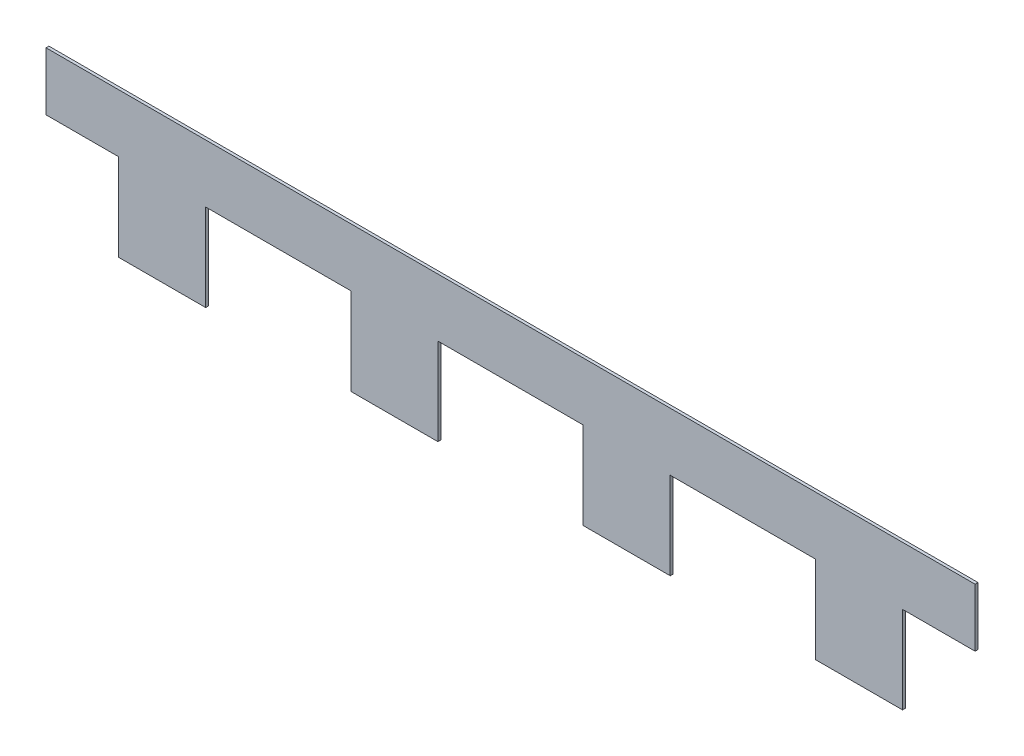
ISO-10303-21;
HEADER;
FILE_DESCRIPTION(('STEP AP214'),'2;1');
FILE_NAME('part.step','',(''),(''),'','','');
FILE_SCHEMA(('AUTOMOTIVE_DESIGN { 1 0 10303 214 1 1 1 1 }'));
ENDSEC;
DATA;
#1=APPLICATION_CONTEXT('core data for automotive mechanical design processes');
#2=APPLICATION_PROTOCOL_DEFINITION('international standard','automotive_design',2000,#1);
#3=PRODUCT_CONTEXT('',#1,'mechanical');
#4=PRODUCT('Part','Part','',(#3));
#5=PRODUCT_RELATED_PRODUCT_CATEGORY('part','',(#4));
#6=PRODUCT_DEFINITION_FORMATION('','',#4);
#7=PRODUCT_DEFINITION_CONTEXT('part definition',#1,'design');
#8=PRODUCT_DEFINITION('design','',#6,#7);
#9=PRODUCT_DEFINITION_SHAPE('','',#8);
#10=(LENGTH_UNIT() NAMED_UNIT(*) SI_UNIT(.MILLI.,.METRE.));
#11=(NAMED_UNIT(*) PLANE_ANGLE_UNIT() SI_UNIT($,.RADIAN.));
#12=(NAMED_UNIT(*) SI_UNIT($,.STERADIAN.) SOLID_ANGLE_UNIT());
#13=UNCERTAINTY_MEASURE_WITH_UNIT(LENGTH_MEASURE(1.E-05),#10,'distance_accuracy_value','');
#14=(GEOMETRIC_REPRESENTATION_CONTEXT(3) GLOBAL_UNCERTAINTY_ASSIGNED_CONTEXT((#13)) GLOBAL_UNIT_ASSIGNED_CONTEXT((#10,
#11,#12)) REPRESENTATION_CONTEXT('',''));
#15=CARTESIAN_POINT('',(0.,0.,0.));
#16=DIRECTION('',(0.,0.,1.));
#17=DIRECTION('',(1.,0.,0.));
#18=AXIS2_PLACEMENT_3D('',#15,#16,#17);
#19=CARTESIAN_POINT('',(-4.,1.,0.1));
#20=DIRECTION('',(1.,0.,0.));
#21=DIRECTION('',(0.,1.,0.));
#22=AXIS2_PLACEMENT_3D('',#19,#20,#21);
#23=PLANE('',#22);
#24=DIRECTION('',(0.,-1.,0.));
#25=VECTOR('',#24,1.);
#26=CARTESIAN_POINT('',(-4.,1.,0.));
#27=LINE('',#26,#25);
#28=CARTESIAN_POINT('',(-4.,1.,0.));
#29=VERTEX_POINT('',#28);
#30=CARTESIAN_POINT('',(-4.,-1.,0.));
#31=VERTEX_POINT('',#30);
#32=EDGE_CURVE('E202',#29,#31,#27,.T.);
#33=ORIENTED_EDGE('',*,*,#32,.T.);
#34=DIRECTION('',(0.,0.,-1.));
#35=VECTOR('',#34,1.);
#36=CARTESIAN_POINT('',(-4.,-1.,0.1));
#37=LINE('',#36,#35);
#38=CARTESIAN_POINT('',(-4.,-1.,0.1));
#39=VERTEX_POINT('',#38);
#40=EDGE_CURVE('E11',#39,#31,#37,.T.);
#41=ORIENTED_EDGE('',*,*,#40,.F.);
#42=DIRECTION('',(0.,-1.,0.));
#43=VECTOR('',#42,1.);
#44=CARTESIAN_POINT('',(-4.,1.,0.1));
#45=LINE('',#44,#43);
#46=CARTESIAN_POINT('',(-4.,1.,0.1));
#47=VERTEX_POINT('',#46);
#48=EDGE_CURVE('E240',#47,#39,#45,.T.);
#49=ORIENTED_EDGE('',*,*,#48,.F.);
#50=DIRECTION('',(0.,0.,-1.));
#51=VECTOR('',#50,1.);
#52=CARTESIAN_POINT('',(-4.,1.,0.1));
#53=LINE('',#52,#51);
#54=EDGE_CURVE('E198',#47,#29,#53,.T.);
#55=ORIENTED_EDGE('',*,*,#54,.T.);
#56=EDGE_LOOP('',(#33,#41,#49,#55));
#57=FACE_BOUND('',#56,.T.);
#58=ADVANCED_FACE('F34',(#57),#23,.F.);
#59=CARTESIAN_POINT('',(-4.,-1.,0.1));
#60=DIRECTION('',(0.,1.,0.));
#61=DIRECTION('',(0.,0.,1.));
#62=AXIS2_PLACEMENT_3D('',#59,#60,#61);
#63=PLANE('',#62);
#64=DIRECTION('',(1.,0.,0.));
#65=VECTOR('',#64,1.);
#66=CARTESIAN_POINT('',(-4.,-1.,0.));
#67=LINE('',#66,#65);
#68=CARTESIAN_POINT('',(-1.5,-1.,0.));
#69=VERTEX_POINT('',#68);
#70=EDGE_CURVE('E205',#31,#69,#67,.T.);
#71=ORIENTED_EDGE('',*,*,#70,.T.);
#72=DIRECTION('',(0.,0.,-1.));
#73=VECTOR('',#72,1.);
#74=CARTESIAN_POINT('',(-1.5,-1.,0.1));
#75=LINE('',#74,#73);
#76=CARTESIAN_POINT('',(-1.5,-1.,0.1));
#77=VERTEX_POINT('',#76);
#78=EDGE_CURVE('E42',#77,#69,#75,.T.);
#79=ORIENTED_EDGE('',*,*,#78,.F.);
#80=DIRECTION('',(1.,0.,0.));
#81=VECTOR('',#80,1.);
#82=CARTESIAN_POINT('',(-4.,-1.,0.1));
#83=LINE('',#82,#81);
#84=EDGE_CURVE('E129',#39,#77,#83,.T.);
#85=ORIENTED_EDGE('',*,*,#84,.F.);
#86=ORIENTED_EDGE('',*,*,#40,.T.);
#87=EDGE_LOOP('',(#71,#79,#85,#86));
#88=FACE_BOUND('',#87,.T.);
#89=ADVANCED_FACE('F358',(#88),#63,.F.);
#90=CARTESIAN_POINT('',(-1.5,-1.,0.1));
#91=DIRECTION('',(1.,0.,0.));
#92=DIRECTION('',(0.,1.,0.));
#93=AXIS2_PLACEMENT_3D('',#90,#91,#92);
#94=PLANE('',#93);
#95=DIRECTION('',(0.,-1.,0.));
#96=VECTOR('',#95,1.);
#97=CARTESIAN_POINT('',(-1.5,-1.,0.));
#98=LINE('',#97,#96);
#99=CARTESIAN_POINT('',(-1.5,-4.,0.));
#100=VERTEX_POINT('',#99);
#101=EDGE_CURVE('E207',#69,#100,#98,.T.);
#102=ORIENTED_EDGE('',*,*,#101,.T.);
#103=DIRECTION('',(0.,0.,-1.));
#104=VECTOR('',#103,1.);
#105=CARTESIAN_POINT('',(-1.5,-4.,0.1));
#106=LINE('',#105,#104);
#107=CARTESIAN_POINT('',(-1.5,-4.,0.1));
#108=VERTEX_POINT('',#107);
#109=EDGE_CURVE('E283',#108,#100,#106,.T.);
#110=ORIENTED_EDGE('',*,*,#109,.F.);
#111=DIRECTION('',(0.,-1.,0.));
#112=VECTOR('',#111,1.);
#113=CARTESIAN_POINT('',(-1.5,-1.,0.1));
#114=LINE('',#113,#112);
#115=EDGE_CURVE('E291',#77,#108,#114,.T.);
#116=ORIENTED_EDGE('',*,*,#115,.F.);
#117=ORIENTED_EDGE('',*,*,#78,.T.);
#118=EDGE_LOOP('',(#102,#110,#116,#117));
#119=FACE_BOUND('',#118,.T.);
#120=ADVANCED_FACE('F289',(#119),#94,.F.);
#121=CARTESIAN_POINT('',(-1.5,-4.,0.1));
#122=DIRECTION('',(0.,1.,0.));
#123=DIRECTION('',(0.,0.,1.));
#124=AXIS2_PLACEMENT_3D('',#121,#122,#123);
#125=PLANE('',#124);
#126=DIRECTION('',(1.,0.,0.));
#127=VECTOR('',#126,1.);
#128=CARTESIAN_POINT('',(-1.5,-4.,0.));
#129=LINE('',#128,#127);
#130=CARTESIAN_POINT('',(1.5,-4.,0.));
#131=VERTEX_POINT('',#130);
#132=EDGE_CURVE('E209',#100,#131,#129,.T.);
#133=ORIENTED_EDGE('',*,*,#132,.T.);
#134=DIRECTION('',(0.,0.,-1.));
#135=VECTOR('',#134,1.);
#136=CARTESIAN_POINT('',(1.5,-4.,0.1));
#137=LINE('',#136,#135);
#138=CARTESIAN_POINT('',(1.5,-4.,0.1));
#139=VERTEX_POINT('',#138);
#140=EDGE_CURVE('E280',#139,#131,#137,.T.);
#141=ORIENTED_EDGE('',*,*,#140,.F.);
#142=DIRECTION('',(1.,0.,0.));
#143=VECTOR('',#142,1.);
#144=CARTESIAN_POINT('',(-1.5,-4.,0.1));
#145=LINE('',#144,#143);
#146=EDGE_CURVE('E309',#108,#139,#145,.T.);
#147=ORIENTED_EDGE('',*,*,#146,.F.);
#148=ORIENTED_EDGE('',*,*,#109,.T.);
#149=EDGE_LOOP('',(#133,#141,#147,#148));
#150=FACE_BOUND('',#149,.T.);
#151=ADVANCED_FACE('F300',(#150),#125,.F.);
#152=CARTESIAN_POINT('',(1.5,-1.,0.1));
#153=DIRECTION('',(-1.,0.,0.));
#154=DIRECTION('',(0.,-1.,0.));
#155=AXIS2_PLACEMENT_3D('',#152,#153,#154);
#156=PLANE('',#155);
#157=DIRECTION('',(0.,1.,0.));
#158=VECTOR('',#157,1.);
#159=CARTESIAN_POINT('',(1.5,-1.,0.));
#160=LINE('',#159,#158);
#161=CARTESIAN_POINT('',(1.5,-1.,0.));
#162=VERTEX_POINT('',#161);
#163=EDGE_CURVE('E211',#131,#162,#160,.T.);
#164=ORIENTED_EDGE('',*,*,#163,.T.);
#165=DIRECTION('',(0.,0.,-1.));
#166=VECTOR('',#165,1.);
#167=CARTESIAN_POINT('',(1.5,-1.,0.1));
#168=LINE('',#167,#166);
#169=CARTESIAN_POINT('',(1.5,-1.,0.1));
#170=VERTEX_POINT('',#169);
#171=EDGE_CURVE('E277',#170,#162,#168,.T.);
#172=ORIENTED_EDGE('',*,*,#171,.F.);
#173=DIRECTION('',(0.,1.,0.));
#174=VECTOR('',#173,1.);
#175=CARTESIAN_POINT('',(1.5,-1.,0.1));
#176=LINE('',#175,#174);
#177=EDGE_CURVE('E306',#139,#170,#176,.T.);
#178=ORIENTED_EDGE('',*,*,#177,.F.);
#179=ORIENTED_EDGE('',*,*,#140,.T.);
#180=EDGE_LOOP('',(#164,#172,#178,#179));
#181=FACE_BOUND('',#180,.T.);
#182=ADVANCED_FACE('F304',(#181),#156,.F.);
#183=CARTESIAN_POINT('',(1.5,-1.,0.1));
#184=DIRECTION('',(0.,1.,0.));
#185=DIRECTION('',(0.,0.,1.));
#186=AXIS2_PLACEMENT_3D('',#183,#184,#185);
#187=PLANE('',#186);
#188=DIRECTION('',(1.,0.,0.));
#189=VECTOR('',#188,1.);
#190=CARTESIAN_POINT('',(1.5,-1.,0.));
#191=LINE('',#190,#189);
#192=CARTESIAN_POINT('',(6.5,-1.,0.));
#193=VERTEX_POINT('',#192);
#194=EDGE_CURVE('E213',#162,#193,#191,.T.);
#195=ORIENTED_EDGE('',*,*,#194,.T.);
#196=DIRECTION('',(0.,0.,-1.));
#197=VECTOR('',#196,1.);
#198=CARTESIAN_POINT('',(6.5,-1.,0.1));
#199=LINE('',#198,#197);
#200=CARTESIAN_POINT('',(6.5,-1.,0.1));
#201=VERTEX_POINT('',#200);
#202=EDGE_CURVE('E274',#201,#193,#199,.T.);
#203=ORIENTED_EDGE('',*,*,#202,.F.);
#204=DIRECTION('',(1.,0.,0.));
#205=VECTOR('',#204,1.);
#206=CARTESIAN_POINT('',(1.5,-1.,0.1));
#207=LINE('',#206,#205);
#208=EDGE_CURVE('E308',#170,#201,#207,.T.);
#209=ORIENTED_EDGE('',*,*,#208,.F.);
#210=ORIENTED_EDGE('',*,*,#171,.T.);
#211=EDGE_LOOP('',(#195,#203,#209,#210));
#212=FACE_BOUND('',#211,.T.);
#213=ADVANCED_FACE('F371',(#212),#187,.F.);
#214=CARTESIAN_POINT('',(6.5,-1.,0.1));
#215=DIRECTION('',(1.,0.,0.));
#216=DIRECTION('',(0.,0.,-1.));
#217=AXIS2_PLACEMENT_3D('',#214,#215,#216);
#218=PLANE('',#217);
#219=DIRECTION('',(0.,-1.,0.));
#220=VECTOR('',#219,1.);
#221=CARTESIAN_POINT('',(6.5,-1.,0.));
#222=LINE('',#221,#220);
#223=CARTESIAN_POINT('',(6.5,-4.,0.));
#224=VERTEX_POINT('',#223);
#225=EDGE_CURVE('E215',#193,#224,#222,.T.);
#226=ORIENTED_EDGE('',*,*,#225,.T.);
#227=DIRECTION('',(0.,0.,-1.));
#228=VECTOR('',#227,1.);
#229=CARTESIAN_POINT('',(6.5,-4.,0.1));
#230=LINE('',#229,#228);
#231=CARTESIAN_POINT('',(6.5,-4.,0.1));
#232=VERTEX_POINT('',#231);
#233=EDGE_CURVE('E271',#232,#224,#230,.T.);
#234=ORIENTED_EDGE('',*,*,#233,.F.);
#235=DIRECTION('',(0.,-1.,0.));
#236=VECTOR('',#235,1.);
#237=CARTESIAN_POINT('',(6.5,-1.,0.1));
#238=LINE('',#237,#236);
#239=EDGE_CURVE('E311',#201,#232,#238,.T.);
#240=ORIENTED_EDGE('',*,*,#239,.F.);
#241=ORIENTED_EDGE('',*,*,#202,.T.);
#242=EDGE_LOOP('',(#226,#234,#240,#241));
#243=FACE_BOUND('',#242,.T.);
#244=ADVANCED_FACE('F374',(#243),#218,.F.);
#245=CARTESIAN_POINT('',(6.5,-4.,0.1));
#246=DIRECTION('',(0.,1.,0.));
#247=DIRECTION('',(0.,0.,1.));
#248=AXIS2_PLACEMENT_3D('',#245,#246,#247);
#249=PLANE('',#248);
#250=DIRECTION('',(1.,0.,0.));
#251=VECTOR('',#250,1.);
#252=CARTESIAN_POINT('',(6.5,-4.,0.));
#253=LINE('',#252,#251);
#254=CARTESIAN_POINT('',(9.5,-4.,0.));
#255=VERTEX_POINT('',#254);
#256=EDGE_CURVE('E217',#224,#255,#253,.T.);
#257=ORIENTED_EDGE('',*,*,#256,.T.);
#258=DIRECTION('',(0.,0.,-1.));
#259=VECTOR('',#258,1.);
#260=CARTESIAN_POINT('',(9.5,-4.,0.1));
#261=LINE('',#260,#259);
#262=CARTESIAN_POINT('',(9.5,-4.,0.1));
#263=VERTEX_POINT('',#262);
#264=EDGE_CURVE('E268',#263,#255,#261,.T.);
#265=ORIENTED_EDGE('',*,*,#264,.F.);
#266=DIRECTION('',(1.,0.,0.));
#267=VECTOR('',#266,1.);
#268=CARTESIAN_POINT('',(6.5,-4.,0.1));
#269=LINE('',#268,#267);
#270=EDGE_CURVE('E317',#232,#263,#269,.T.);
#271=ORIENTED_EDGE('',*,*,#270,.F.);
#272=ORIENTED_EDGE('',*,*,#233,.T.);
#273=EDGE_LOOP('',(#257,#265,#271,#272));
#274=FACE_BOUND('',#273,.T.);
#275=ADVANCED_FACE('F378',(#274),#249,.F.);
#276=CARTESIAN_POINT('',(9.5,-1.,0.1));
#277=DIRECTION('',(-1.,0.,0.));
#278=DIRECTION('',(0.,-1.,0.));
#279=AXIS2_PLACEMENT_3D('',#276,#277,#278);
#280=PLANE('',#279);
#281=DIRECTION('',(0.,1.,0.));
#282=VECTOR('',#281,1.);
#283=CARTESIAN_POINT('',(9.5,-1.,0.));
#284=LINE('',#283,#282);
#285=CARTESIAN_POINT('',(9.5,-1.,0.));
#286=VERTEX_POINT('',#285);
#287=EDGE_CURVE('E219',#255,#286,#284,.T.);
#288=ORIENTED_EDGE('',*,*,#287,.T.);
#289=DIRECTION('',(0.,0.,-1.));
#290=VECTOR('',#289,1.);
#291=CARTESIAN_POINT('',(9.5,-1.,0.1));
#292=LINE('',#291,#290);
#293=CARTESIAN_POINT('',(9.5,-1.,0.1));
#294=VERTEX_POINT('',#293);
#295=EDGE_CURVE('E265',#294,#286,#292,.T.);
#296=ORIENTED_EDGE('',*,*,#295,.F.);
#297=DIRECTION('',(0.,1.,0.));
#298=VECTOR('',#297,1.);
#299=CARTESIAN_POINT('',(9.5,-1.,0.1));
#300=LINE('',#299,#298);
#301=EDGE_CURVE('E319',#263,#294,#300,.T.);
#302=ORIENTED_EDGE('',*,*,#301,.F.);
#303=ORIENTED_EDGE('',*,*,#264,.T.);
#304=EDGE_LOOP('',(#288,#296,#302,#303));
#305=FACE_BOUND('',#304,.T.);
#306=ADVANCED_FACE('F382',(#305),#280,.F.);
#307=CARTESIAN_POINT('',(9.5,-1.,0.1));
#308=DIRECTION('',(0.,1.,0.));
#309=DIRECTION('',(0.,0.,1.));
#310=AXIS2_PLACEMENT_3D('',#307,#308,#309);
#311=PLANE('',#310);
#312=DIRECTION('',(1.,0.,0.));
#313=VECTOR('',#312,1.);
#314=CARTESIAN_POINT('',(9.5,-1.,0.));
#315=LINE('',#314,#313);
#316=CARTESIAN_POINT('',(14.5,-1.,0.));
#317=VERTEX_POINT('',#316);
#318=EDGE_CURVE('E221',#286,#317,#315,.T.);
#319=ORIENTED_EDGE('',*,*,#318,.T.);
#320=DIRECTION('',(0.,0.,-1.));
#321=VECTOR('',#320,1.);
#322=CARTESIAN_POINT('',(14.5,-1.,0.1));
#323=LINE('',#322,#321);
#324=CARTESIAN_POINT('',(14.5,-1.,0.1));
#325=VERTEX_POINT('',#324);
#326=EDGE_CURVE('E262',#325,#317,#323,.T.);
#327=ORIENTED_EDGE('',*,*,#326,.F.);
#328=DIRECTION('',(1.,0.,0.));
#329=VECTOR('',#328,1.);
#330=CARTESIAN_POINT('',(9.5,-1.,0.1));
#331=LINE('',#330,#329);
#332=EDGE_CURVE('E321',#294,#325,#331,.T.);
#333=ORIENTED_EDGE('',*,*,#332,.F.);
#334=ORIENTED_EDGE('',*,*,#295,.T.);
#335=EDGE_LOOP('',(#319,#327,#333,#334));
#336=FACE_BOUND('',#335,.T.);
#337=ADVANCED_FACE('F386',(#336),#311,.F.);
#338=CARTESIAN_POINT('',(14.5,-1.,0.1));
#339=DIRECTION('',(1.,0.,0.));
#340=DIRECTION('',(0.,0.,-1.));
#341=AXIS2_PLACEMENT_3D('',#338,#339,#340);
#342=PLANE('',#341);
#343=DIRECTION('',(0.,-1.,0.));
#344=VECTOR('',#343,1.);
#345=CARTESIAN_POINT('',(14.5,-1.,0.));
#346=LINE('',#345,#344);
#347=CARTESIAN_POINT('',(14.5,-4.,0.));
#348=VERTEX_POINT('',#347);
#349=EDGE_CURVE('E223',#317,#348,#346,.T.);
#350=ORIENTED_EDGE('',*,*,#349,.T.);
#351=DIRECTION('',(0.,0.,-1.));
#352=VECTOR('',#351,1.);
#353=CARTESIAN_POINT('',(14.5,-4.,0.1));
#354=LINE('',#353,#352);
#355=CARTESIAN_POINT('',(14.5,-4.,0.1));
#356=VERTEX_POINT('',#355);
#357=EDGE_CURVE('E259',#356,#348,#354,.T.);
#358=ORIENTED_EDGE('',*,*,#357,.F.);
#359=DIRECTION('',(0.,-1.,0.));
#360=VECTOR('',#359,1.);
#361=CARTESIAN_POINT('',(14.5,-1.,0.1));
#362=LINE('',#361,#360);
#363=EDGE_CURVE('E323',#325,#356,#362,.T.);
#364=ORIENTED_EDGE('',*,*,#363,.F.);
#365=ORIENTED_EDGE('',*,*,#326,.T.);
#366=EDGE_LOOP('',(#350,#358,#364,#365));
#367=FACE_BOUND('',#366,.T.);
#368=ADVANCED_FACE('F390',(#367),#342,.F.);
#369=CARTESIAN_POINT('',(14.5,-4.,0.1));
#370=DIRECTION('',(0.,1.,0.));
#371=DIRECTION('',(0.,0.,1.));
#372=AXIS2_PLACEMENT_3D('',#369,#370,#371);
#373=PLANE('',#372);
#374=DIRECTION('',(1.,0.,0.));
#375=VECTOR('',#374,1.);
#376=CARTESIAN_POINT('',(14.5,-4.,0.));
#377=LINE('',#376,#375);
#378=CARTESIAN_POINT('',(17.5,-4.,0.));
#379=VERTEX_POINT('',#378);
#380=EDGE_CURVE('E225',#348,#379,#377,.T.);
#381=ORIENTED_EDGE('',*,*,#380,.T.);
#382=DIRECTION('',(0.,0.,-1.));
#383=VECTOR('',#382,1.);
#384=CARTESIAN_POINT('',(17.5,-4.,0.1));
#385=LINE('',#384,#383);
#386=CARTESIAN_POINT('',(17.5,-4.,0.1));
#387=VERTEX_POINT('',#386);
#388=EDGE_CURVE('E256',#387,#379,#385,.T.);
#389=ORIENTED_EDGE('',*,*,#388,.F.);
#390=DIRECTION('',(1.,0.,0.));
#391=VECTOR('',#390,1.);
#392=CARTESIAN_POINT('',(14.5,-4.,0.1));
#393=LINE('',#392,#391);
#394=EDGE_CURVE('E325',#356,#387,#393,.T.);
#395=ORIENTED_EDGE('',*,*,#394,.F.);
#396=ORIENTED_EDGE('',*,*,#357,.T.);
#397=EDGE_LOOP('',(#381,#389,#395,#396));
#398=FACE_BOUND('',#397,.T.);
#399=ADVANCED_FACE('F394',(#398),#373,.F.);
#400=CARTESIAN_POINT('',(17.5,-1.,0.1));
#401=DIRECTION('',(-1.,0.,0.));
#402=DIRECTION('',(0.,0.,1.));
#403=AXIS2_PLACEMENT_3D('',#400,#401,#402);
#404=PLANE('',#403);
#405=DIRECTION('',(0.,1.,0.));
#406=VECTOR('',#405,1.);
#407=CARTESIAN_POINT('',(17.5,-1.,0.));
#408=LINE('',#407,#406);
#409=CARTESIAN_POINT('',(17.5,-1.,0.));
#410=VERTEX_POINT('',#409);
#411=EDGE_CURVE('E227',#379,#410,#408,.T.);
#412=ORIENTED_EDGE('',*,*,#411,.T.);
#413=DIRECTION('',(0.,0.,-1.));
#414=VECTOR('',#413,1.);
#415=CARTESIAN_POINT('',(17.5,-1.,0.1));
#416=LINE('',#415,#414);
#417=CARTESIAN_POINT('',(17.5,-1.,0.1));
#418=VERTEX_POINT('',#417);
#419=EDGE_CURVE('E253',#418,#410,#416,.T.);
#420=ORIENTED_EDGE('',*,*,#419,.F.);
#421=DIRECTION('',(0.,1.,0.));
#422=VECTOR('',#421,1.);
#423=CARTESIAN_POINT('',(17.5,-1.,0.1));
#424=LINE('',#423,#422);
#425=EDGE_CURVE('E327',#387,#418,#424,.T.);
#426=ORIENTED_EDGE('',*,*,#425,.F.);
#427=ORIENTED_EDGE('',*,*,#388,.T.);
#428=EDGE_LOOP('',(#412,#420,#426,#427));
#429=FACE_BOUND('',#428,.T.);
#430=ADVANCED_FACE('F398',(#429),#404,.F.);
#431=CARTESIAN_POINT('',(17.5,-1.,0.1));
#432=DIRECTION('',(0.,1.,0.));
#433=DIRECTION('',(0.,0.,1.));
#434=AXIS2_PLACEMENT_3D('',#431,#432,#433);
#435=PLANE('',#434);
#436=DIRECTION('',(1.,0.,0.));
#437=VECTOR('',#436,1.);
#438=CARTESIAN_POINT('',(17.5,-1.,0.));
#439=LINE('',#438,#437);
#440=CARTESIAN_POINT('',(22.5,-1.,0.));
#441=VERTEX_POINT('',#440);
#442=EDGE_CURVE('E229',#410,#441,#439,.T.);
#443=ORIENTED_EDGE('',*,*,#442,.T.);
#444=DIRECTION('',(0.,0.,-1.));
#445=VECTOR('',#444,1.);
#446=CARTESIAN_POINT('',(22.5,-1.,0.1));
#447=LINE('',#446,#445);
#448=CARTESIAN_POINT('',(22.5,-1.,0.1));
#449=VERTEX_POINT('',#448);
#450=EDGE_CURVE('E250',#449,#441,#447,.T.);
#451=ORIENTED_EDGE('',*,*,#450,.F.);
#452=DIRECTION('',(1.,0.,0.));
#453=VECTOR('',#452,1.);
#454=CARTESIAN_POINT('',(17.5,-1.,0.1));
#455=LINE('',#454,#453);
#456=EDGE_CURVE('E329',#418,#449,#455,.T.);
#457=ORIENTED_EDGE('',*,*,#456,.F.);
#458=ORIENTED_EDGE('',*,*,#419,.T.);
#459=EDGE_LOOP('',(#443,#451,#457,#458));
#460=FACE_BOUND('',#459,.T.);
#461=ADVANCED_FACE('F402',(#460),#435,.F.);
#462=CARTESIAN_POINT('',(22.5,-1.,0.1));
#463=DIRECTION('',(1.,0.,0.));
#464=DIRECTION('',(0.,1.,0.));
#465=AXIS2_PLACEMENT_3D('',#462,#463,#464);
#466=PLANE('',#465);
#467=DIRECTION('',(0.,-1.,0.));
#468=VECTOR('',#467,1.);
#469=CARTESIAN_POINT('',(22.5,-1.,0.));
#470=LINE('',#469,#468);
#471=CARTESIAN_POINT('',(22.5,-4.,0.));
#472=VERTEX_POINT('',#471);
#473=EDGE_CURVE('E231',#441,#472,#470,.T.);
#474=ORIENTED_EDGE('',*,*,#473,.T.);
#475=DIRECTION('',(0.,0.,-1.));
#476=VECTOR('',#475,1.);
#477=CARTESIAN_POINT('',(22.5,-4.,0.1));
#478=LINE('',#477,#476);
#479=CARTESIAN_POINT('',(22.5,-4.,0.1));
#480=VERTEX_POINT('',#479);
#481=EDGE_CURVE('E247',#480,#472,#478,.T.);
#482=ORIENTED_EDGE('',*,*,#481,.F.);
#483=DIRECTION('',(0.,-1.,0.));
#484=VECTOR('',#483,1.);
#485=CARTESIAN_POINT('',(22.5,-1.,0.1));
#486=LINE('',#485,#484);
#487=EDGE_CURVE('E331',#449,#480,#486,.T.);
#488=ORIENTED_EDGE('',*,*,#487,.F.);
#489=ORIENTED_EDGE('',*,*,#450,.T.);
#490=EDGE_LOOP('',(#474,#482,#488,#489));
#491=FACE_BOUND('',#490,.T.);
#492=ADVANCED_FACE('F406',(#491),#466,.F.);
#493=CARTESIAN_POINT('',(22.5,-4.,0.1));
#494=DIRECTION('',(0.,1.,0.));
#495=DIRECTION('',(0.,0.,1.));
#496=AXIS2_PLACEMENT_3D('',#493,#494,#495);
#497=PLANE('',#496);
#498=DIRECTION('',(1.,0.,0.));
#499=VECTOR('',#498,1.);
#500=CARTESIAN_POINT('',(22.5,-4.,0.));
#501=LINE('',#500,#499);
#502=CARTESIAN_POINT('',(25.5,-4.,0.));
#503=VERTEX_POINT('',#502);
#504=EDGE_CURVE('E233',#472,#503,#501,.T.);
#505=ORIENTED_EDGE('',*,*,#504,.T.);
#506=DIRECTION('',(0.,0.,-1.));
#507=VECTOR('',#506,1.);
#508=CARTESIAN_POINT('',(25.5,-4.,0.1));
#509=LINE('',#508,#507);
#510=CARTESIAN_POINT('',(25.5,-4.,0.1));
#511=VERTEX_POINT('',#510);
#512=EDGE_CURVE('E244',#511,#503,#509,.T.);
#513=ORIENTED_EDGE('',*,*,#512,.F.);
#514=DIRECTION('',(1.,0.,0.));
#515=VECTOR('',#514,1.);
#516=CARTESIAN_POINT('',(22.5,-4.,0.1));
#517=LINE('',#516,#515);
#518=EDGE_CURVE('E333',#480,#511,#517,.T.);
#519=ORIENTED_EDGE('',*,*,#518,.F.);
#520=ORIENTED_EDGE('',*,*,#481,.T.);
#521=EDGE_LOOP('',(#505,#513,#519,#520));
#522=FACE_BOUND('',#521,.T.);
#523=ADVANCED_FACE('F339',(#522),#497,.F.);
#524=CARTESIAN_POINT('',(25.5,-1.,0.1));
#525=DIRECTION('',(-1.,0.,0.));
#526=DIRECTION('',(0.,0.,1.));
#527=AXIS2_PLACEMENT_3D('',#524,#525,#526);
#528=PLANE('',#527);
#529=DIRECTION('',(0.,1.,0.));
#530=VECTOR('',#529,1.);
#531=CARTESIAN_POINT('',(25.5,-1.,0.));
#532=LINE('',#531,#530);
#533=CARTESIAN_POINT('',(25.5,-1.,0.));
#534=VERTEX_POINT('',#533);
#535=EDGE_CURVE('E235',#503,#534,#532,.T.);
#536=ORIENTED_EDGE('',*,*,#535,.T.);
#537=DIRECTION('',(0.,0.,-1.));
#538=VECTOR('',#537,1.);
#539=CARTESIAN_POINT('',(25.5,-1.,0.1));
#540=LINE('',#539,#538);
#541=CARTESIAN_POINT('',(25.5,-1.,0.1));
#542=VERTEX_POINT('',#541);
#543=EDGE_CURVE('E193',#542,#534,#540,.T.);
#544=ORIENTED_EDGE('',*,*,#543,.F.);
#545=DIRECTION('',(0.,1.,0.));
#546=VECTOR('',#545,1.);
#547=CARTESIAN_POINT('',(25.5,-1.,0.1));
#548=LINE('',#547,#546);
#549=EDGE_CURVE('E184',#511,#542,#548,.T.);
#550=ORIENTED_EDGE('',*,*,#549,.F.);
#551=ORIENTED_EDGE('',*,*,#512,.T.);
#552=EDGE_LOOP('',(#536,#544,#550,#551));
#553=FACE_BOUND('',#552,.T.);
#554=ADVANCED_FACE('F343',(#553),#528,.F.);
#555=CARTESIAN_POINT('',(25.5,-1.,0.1));
#556=DIRECTION('',(0.,1.,0.));
#557=DIRECTION('',(0.,0.,1.));
#558=AXIS2_PLACEMENT_3D('',#555,#556,#557);
#559=PLANE('',#558);
#560=DIRECTION('',(1.,0.,0.));
#561=VECTOR('',#560,1.);
#562=CARTESIAN_POINT('',(25.5,-1.,0.));
#563=LINE('',#562,#561);
#564=CARTESIAN_POINT('',(28.,-1.,0.));
#565=VERTEX_POINT('',#564);
#566=EDGE_CURVE('E192',#534,#565,#563,.T.);
#567=ORIENTED_EDGE('',*,*,#566,.T.);
#568=DIRECTION('',(0.,0.,-1.));
#569=VECTOR('',#568,1.);
#570=CARTESIAN_POINT('',(28.,-1.,0.1));
#571=LINE('',#570,#569);
#572=CARTESIAN_POINT('',(28.,-1.,0.1));
#573=VERTEX_POINT('',#572);
#574=EDGE_CURVE('E189',#573,#565,#571,.T.);
#575=ORIENTED_EDGE('',*,*,#574,.F.);
#576=DIRECTION('',(1.,0.,0.));
#577=VECTOR('',#576,1.);
#578=CARTESIAN_POINT('',(25.5,-1.,0.1));
#579=LINE('',#578,#577);
#580=EDGE_CURVE('E178',#542,#573,#579,.T.);
#581=ORIENTED_EDGE('',*,*,#580,.F.);
#582=ORIENTED_EDGE('',*,*,#543,.T.);
#583=EDGE_LOOP('',(#567,#575,#581,#582));
#584=FACE_BOUND('',#583,.T.);
#585=ADVANCED_FACE('F190',(#584),#559,.F.);
#586=CARTESIAN_POINT('',(28.,1.,0.1));
#587=DIRECTION('',(-1.,0.,0.));
#588=DIRECTION('',(0.,0.,1.));
#589=AXIS2_PLACEMENT_3D('',#586,#587,#588);
#590=PLANE('',#589);
#591=DIRECTION('',(0.,1.,0.));
#592=VECTOR('',#591,1.);
#593=CARTESIAN_POINT('',(28.,1.,0.));
#594=LINE('',#593,#592);
#595=CARTESIAN_POINT('',(28.,1.,0.));
#596=VERTEX_POINT('',#595);
#597=EDGE_CURVE('E115',#565,#596,#594,.T.);
#598=ORIENTED_EDGE('',*,*,#597,.T.);
#599=DIRECTION('',(0.,0.,-1.));
#600=VECTOR('',#599,1.);
#601=CARTESIAN_POINT('',(28.,1.,0.1));
#602=LINE('',#601,#600);
#603=CARTESIAN_POINT('',(28.,1.,0.1));
#604=VERTEX_POINT('',#603);
#605=EDGE_CURVE('E194',#604,#596,#602,.T.);
#606=ORIENTED_EDGE('',*,*,#605,.F.);
#607=DIRECTION('',(0.,1.,0.));
#608=VECTOR('',#607,1.);
#609=CARTESIAN_POINT('',(28.,1.,0.1));
#610=LINE('',#609,#608);
#611=EDGE_CURVE('E182',#573,#604,#610,.T.);
#612=ORIENTED_EDGE('',*,*,#611,.F.);
#613=ORIENTED_EDGE('',*,*,#574,.T.);
#614=EDGE_LOOP('',(#598,#606,#612,#613));
#615=FACE_BOUND('',#614,.T.);
#616=ADVANCED_FACE('F196',(#615),#590,.F.);
#617=CARTESIAN_POINT('',(-4.,1.,0.1));
#618=DIRECTION('',(0.,-1.,0.));
#619=DIRECTION('',(0.,0.,-1.));
#620=AXIS2_PLACEMENT_3D('',#617,#618,#619);
#621=PLANE('',#620);
#622=DIRECTION('',(-1.,0.,0.));
#623=VECTOR('',#622,1.);
#624=CARTESIAN_POINT('',(-4.,1.,0.));
#625=LINE('',#624,#623);
#626=EDGE_CURVE('E121',#596,#29,#625,.T.);
#627=ORIENTED_EDGE('',*,*,#626,.T.);
#628=ORIENTED_EDGE('',*,*,#54,.F.);
#629=DIRECTION('',(-1.,0.,0.));
#630=VECTOR('',#629,1.);
#631=CARTESIAN_POINT('',(-4.,1.,0.1));
#632=LINE('',#631,#630);
#633=EDGE_CURVE('E50',#604,#47,#632,.T.);
#634=ORIENTED_EDGE('',*,*,#633,.F.);
#635=ORIENTED_EDGE('',*,*,#605,.T.);
#636=EDGE_LOOP('',(#627,#628,#634,#635));
#637=FACE_BOUND('',#636,.T.);
#638=ADVANCED_FACE('F347',(#637),#621,.F.);
#639=CARTESIAN_POINT('',(0.,0.,0.1));
#640=DIRECTION('',(0.,0.,1.));
#641=DIRECTION('',(1.,0.,0.));
#642=AXIS2_PLACEMENT_3D('',#639,#640,#641);
#643=PLANE('',#642);
#644=ORIENTED_EDGE('',*,*,#48,.T.);
#645=ORIENTED_EDGE('',*,*,#84,.T.);
#646=ORIENTED_EDGE('',*,*,#115,.T.);
#647=ORIENTED_EDGE('',*,*,#146,.T.);
#648=ORIENTED_EDGE('',*,*,#177,.T.);
#649=ORIENTED_EDGE('',*,*,#208,.T.);
#650=ORIENTED_EDGE('',*,*,#239,.T.);
#651=ORIENTED_EDGE('',*,*,#270,.T.);
#652=ORIENTED_EDGE('',*,*,#301,.T.);
#653=ORIENTED_EDGE('',*,*,#332,.T.);
#654=ORIENTED_EDGE('',*,*,#363,.T.);
#655=ORIENTED_EDGE('',*,*,#394,.T.);
#656=ORIENTED_EDGE('',*,*,#425,.T.);
#657=ORIENTED_EDGE('',*,*,#456,.T.);
#658=ORIENTED_EDGE('',*,*,#487,.T.);
#659=ORIENTED_EDGE('',*,*,#518,.T.);
#660=ORIENTED_EDGE('',*,*,#549,.T.);
#661=ORIENTED_EDGE('',*,*,#580,.T.);
#662=ORIENTED_EDGE('',*,*,#611,.T.);
#663=ORIENTED_EDGE('',*,*,#633,.T.);
#664=EDGE_LOOP('',(#644,#645,#646,#647,#648,#649,#650,#651,#652,#653,#654,#655,#656,#657,#658,
#659,#660,#661,#662,#663));
#665=FACE_BOUND('',#664,.T.);
#666=ADVANCED_FACE('F180',(#665),#643,.T.);
#667=CARTESIAN_POINT('',(0.,0.,0.));
#668=DIRECTION('',(0.,0.,1.));
#669=DIRECTION('',(1.,0.,0.));
#670=AXIS2_PLACEMENT_3D('',#667,#668,#669);
#671=PLANE('',#670);
#672=ORIENTED_EDGE('',*,*,#32,.F.);
#673=ORIENTED_EDGE('',*,*,#626,.F.);
#674=ORIENTED_EDGE('',*,*,#597,.F.);
#675=ORIENTED_EDGE('',*,*,#566,.F.);
#676=ORIENTED_EDGE('',*,*,#535,.F.);
#677=ORIENTED_EDGE('',*,*,#504,.F.);
#678=ORIENTED_EDGE('',*,*,#473,.F.);
#679=ORIENTED_EDGE('',*,*,#442,.F.);
#680=ORIENTED_EDGE('',*,*,#411,.F.);
#681=ORIENTED_EDGE('',*,*,#380,.F.);
#682=ORIENTED_EDGE('',*,*,#349,.F.);
#683=ORIENTED_EDGE('',*,*,#318,.F.);
#684=ORIENTED_EDGE('',*,*,#287,.F.);
#685=ORIENTED_EDGE('',*,*,#256,.F.);
#686=ORIENTED_EDGE('',*,*,#225,.F.);
#687=ORIENTED_EDGE('',*,*,#194,.F.);
#688=ORIENTED_EDGE('',*,*,#163,.F.);
#689=ORIENTED_EDGE('',*,*,#132,.F.);
#690=ORIENTED_EDGE('',*,*,#101,.F.);
#691=ORIENTED_EDGE('',*,*,#70,.F.);
#692=EDGE_LOOP('',(#672,#673,#674,#675,#676,#677,#678,#679,#680,#681,#682,#683,#684,#685,#686,
#687,#688,#689,#690,#691));
#693=FACE_BOUND('',#692,.T.);
#694=ADVANCED_FACE('F295',(#693),#671,.F.);
#695=CLOSED_SHELL('',(#58,#89,#120,#151,#182,#213,#244,#275,#306,#337,#368,#399,#430,#461,#492,
#523,#554,#585,#616,#638,#666,#694));
#696=MANIFOLD_SOLID_BREP('B2',#695);
#697=ADVANCED_BREP_SHAPE_REPRESENTATION('',(#18,#696),#14);
#698=SHAPE_DEFINITION_REPRESENTATION(#9,#697);
ENDSEC;
END-ISO-10303-21;
